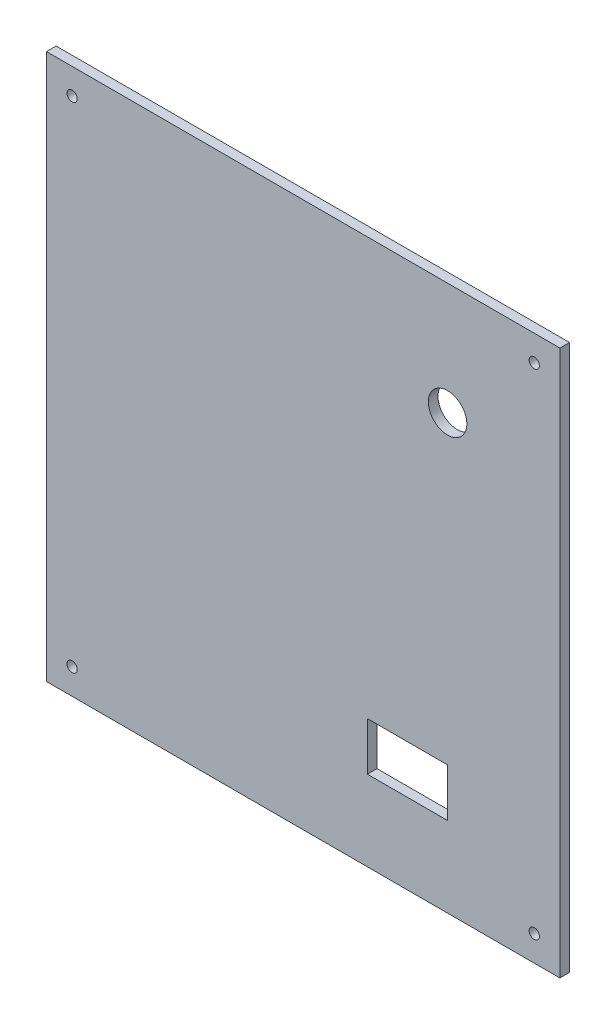
ISO-10303-21;
HEADER;
FILE_DESCRIPTION(('STEP AP214'),'2;1');
FILE_NAME('part.step','',(''),(''),'','','');
FILE_SCHEMA(('AUTOMOTIVE_DESIGN { 1 0 10303 214 1 1 1 1 }'));
ENDSEC;
DATA;
#1=APPLICATION_CONTEXT('core data for automotive mechanical design processes');
#2=APPLICATION_PROTOCOL_DEFINITION('international standard','automotive_design',2000,#1);
#3=PRODUCT_CONTEXT('',#1,'mechanical');
#4=PRODUCT('Part','Part','',(#3));
#5=PRODUCT_RELATED_PRODUCT_CATEGORY('part','',(#4));
#6=PRODUCT_DEFINITION_FORMATION('','',#4);
#7=PRODUCT_DEFINITION_CONTEXT('part definition',#1,'design');
#8=PRODUCT_DEFINITION('design','',#6,#7);
#9=PRODUCT_DEFINITION_SHAPE('','',#8);
#10=(LENGTH_UNIT() NAMED_UNIT(*) SI_UNIT(.MILLI.,.METRE.));
#11=(NAMED_UNIT(*) PLANE_ANGLE_UNIT() SI_UNIT($,.RADIAN.));
#12=(NAMED_UNIT(*) SI_UNIT($,.STERADIAN.) SOLID_ANGLE_UNIT());
#13=UNCERTAINTY_MEASURE_WITH_UNIT(LENGTH_MEASURE(1.E-05),#10,'distance_accuracy_value','');
#14=(GEOMETRIC_REPRESENTATION_CONTEXT(3) GLOBAL_UNCERTAINTY_ASSIGNED_CONTEXT((#13)) GLOBAL_UNIT_ASSIGNED_CONTEXT((#10,
#11,#12)) REPRESENTATION_CONTEXT('',''));
#15=CARTESIAN_POINT('',(0.,0.,0.));
#16=DIRECTION('',(0.,0.,1.));
#17=DIRECTION('',(1.,0.,0.));
#18=AXIS2_PLACEMENT_3D('',#15,#16,#17);
#19=CARTESIAN_POINT('',(-44.5833333333333,38.75,3.));
#20=DIRECTION('',(1.,0.,0.));
#21=DIRECTION('',(0.,1.,0.));
#22=AXIS2_PLACEMENT_3D('',#19,#20,#21);
#23=PLANE('',#22);
#24=DIRECTION('',(0.,-1.,0.));
#25=VECTOR('',#24,1.);
#26=CARTESIAN_POINT('',(-44.5833333333333,38.75,0.));
#27=LINE('',#26,#25);
#28=CARTESIAN_POINT('',(-44.5833333333333,38.75,0.));
#29=VERTEX_POINT('',#28);
#30=CARTESIAN_POINT('',(-44.5833333333333,-131.25,0.));
#31=VERTEX_POINT('',#30);
#32=EDGE_CURVE('E185',#29,#31,#27,.T.);
#33=ORIENTED_EDGE('',*,*,#32,.T.);
#34=DIRECTION('',(0.,0.,-1.));
#35=VECTOR('',#34,1.);
#36=CARTESIAN_POINT('',(-44.5833333333333,-131.25,3.));
#37=LINE('',#36,#35);
#38=CARTESIAN_POINT('',(-44.5833333333333,-131.25,3.));
#39=VERTEX_POINT('',#38);
#40=EDGE_CURVE('E208',#39,#31,#37,.T.);
#41=ORIENTED_EDGE('',*,*,#40,.F.);
#42=DIRECTION('',(0.,-1.,0.));
#43=VECTOR('',#42,1.);
#44=CARTESIAN_POINT('',(-44.5833333333333,38.75,3.));
#45=LINE('',#44,#43);
#46=CARTESIAN_POINT('',(-44.5833333333333,38.75,3.));
#47=VERTEX_POINT('',#46);
#48=EDGE_CURVE('E170',#47,#39,#45,.T.);
#49=ORIENTED_EDGE('',*,*,#48,.F.);
#50=DIRECTION('',(0.,0.,-1.));
#51=VECTOR('',#50,1.);
#52=CARTESIAN_POINT('',(-44.5833333333333,38.75,3.));
#53=LINE('',#52,#51);
#54=EDGE_CURVE('E184',#47,#29,#53,.T.);
#55=ORIENTED_EDGE('',*,*,#54,.T.);
#56=EDGE_LOOP('',(#33,#41,#49,#55));
#57=FACE_BOUND('',#56,.T.);
#58=ADVANCED_FACE('F47',(#57),#23,.F.);
#59=CARTESIAN_POINT('',(-44.5833333333333,-131.25,3.));
#60=DIRECTION('',(0.,1.,0.));
#61=DIRECTION('',(0.,0.,1.));
#62=AXIS2_PLACEMENT_3D('',#59,#60,#61);
#63=PLANE('',#62);
#64=DIRECTION('',(1.,0.,0.));
#65=VECTOR('',#64,1.);
#66=CARTESIAN_POINT('',(-44.5833333333333,-131.25,0.));
#67=LINE('',#66,#65);
#68=CARTESIAN_POINT('',(115.416666666667,-131.25,0.));
#69=VERTEX_POINT('',#68);
#70=EDGE_CURVE('E189',#31,#69,#67,.T.);
#71=ORIENTED_EDGE('',*,*,#70,.T.);
#72=DIRECTION('',(0.,0.,-1.));
#73=VECTOR('',#72,1.);
#74=CARTESIAN_POINT('',(115.416666666667,-131.25,3.));
#75=LINE('',#74,#73);
#76=CARTESIAN_POINT('',(115.416666666667,-131.25,3.));
#77=VERTEX_POINT('',#76);
#78=EDGE_CURVE('E204',#77,#69,#75,.T.);
#79=ORIENTED_EDGE('',*,*,#78,.F.);
#80=DIRECTION('',(1.,0.,0.));
#81=VECTOR('',#80,1.);
#82=CARTESIAN_POINT('',(-44.5833333333333,-131.25,3.));
#83=LINE('',#82,#81);
#84=EDGE_CURVE('E174',#39,#77,#83,.T.);
#85=ORIENTED_EDGE('',*,*,#84,.F.);
#86=ORIENTED_EDGE('',*,*,#40,.T.);
#87=EDGE_LOOP('',(#71,#79,#85,#86));
#88=FACE_BOUND('',#87,.T.);
#89=ADVANCED_FACE('F255',(#88),#63,.F.);
#90=CARTESIAN_POINT('',(115.416666666667,38.75,3.));
#91=DIRECTION('',(-1.,0.,0.));
#92=DIRECTION('',(0.,-1.,0.));
#93=AXIS2_PLACEMENT_3D('',#90,#91,#92);
#94=PLANE('',#93);
#95=DIRECTION('',(0.,1.,0.));
#96=VECTOR('',#95,1.);
#97=CARTESIAN_POINT('',(115.416666666667,38.75,0.));
#98=LINE('',#97,#96);
#99=CARTESIAN_POINT('',(115.416666666667,38.75,0.));
#100=VERTEX_POINT('',#99);
#101=EDGE_CURVE('E193',#69,#100,#98,.T.);
#102=ORIENTED_EDGE('',*,*,#101,.T.);
#103=DIRECTION('',(0.,0.,-1.));
#104=VECTOR('',#103,1.);
#105=CARTESIAN_POINT('',(115.416666666667,38.75,3.));
#106=LINE('',#105,#104);
#107=CARTESIAN_POINT('',(115.416666666667,38.75,3.));
#108=VERTEX_POINT('',#107);
#109=EDGE_CURVE('E201',#108,#100,#106,.T.);
#110=ORIENTED_EDGE('',*,*,#109,.F.);
#111=DIRECTION('',(0.,1.,0.));
#112=VECTOR('',#111,1.);
#113=CARTESIAN_POINT('',(115.416666666667,38.75,3.));
#114=LINE('',#113,#112);
#115=EDGE_CURVE('E178',#77,#108,#114,.T.);
#116=ORIENTED_EDGE('',*,*,#115,.F.);
#117=ORIENTED_EDGE('',*,*,#78,.T.);
#118=EDGE_LOOP('',(#102,#110,#116,#117));
#119=FACE_BOUND('',#118,.T.);
#120=ADVANCED_FACE('F260',(#119),#94,.F.);
#121=CARTESIAN_POINT('',(-44.5833333333333,38.75,3.));
#122=DIRECTION('',(0.,-1.,0.));
#123=DIRECTION('',(0.,0.,-1.));
#124=AXIS2_PLACEMENT_3D('',#121,#122,#123);
#125=PLANE('',#124);
#126=DIRECTION('',(-1.,0.,0.));
#127=VECTOR('',#126,1.);
#128=CARTESIAN_POINT('',(-44.5833333333333,38.75,0.));
#129=LINE('',#128,#127);
#130=EDGE_CURVE('E175',#100,#29,#129,.T.);
#131=ORIENTED_EDGE('',*,*,#130,.T.);
#132=ORIENTED_EDGE('',*,*,#54,.F.);
#133=DIRECTION('',(-1.,0.,0.));
#134=VECTOR('',#133,1.);
#135=CARTESIAN_POINT('',(-44.5833333333333,38.75,3.));
#136=LINE('',#135,#134);
#137=EDGE_CURVE('E181',#108,#47,#136,.T.);
#138=ORIENTED_EDGE('',*,*,#137,.F.);
#139=ORIENTED_EDGE('',*,*,#109,.T.);
#140=EDGE_LOOP('',(#131,#132,#138,#139));
#141=FACE_BOUND('',#140,.T.);
#142=ADVANCED_FACE('F275',(#141),#125,.F.);
#143=CARTESIAN_POINT('',(0.,0.,3.));
#144=DIRECTION('',(0.,0.,1.));
#145=DIRECTION('',(1.,0.,0.));
#146=AXIS2_PLACEMENT_3D('',#143,#144,#145);
#147=PLANE('',#146);
#148=DIRECTION('',(0.,-1.,0.));
#149=VECTOR('',#148,1.);
#150=CARTESIAN_POINT('',(55.4166666666667,-91.25,3.));
#151=LINE('',#150,#149);
#152=CARTESIAN_POINT('',(55.4166666666667,-91.25,3.));
#153=VERTEX_POINT('',#152);
#154=CARTESIAN_POINT('',(55.4166666666667,-106.25,3.));
#155=VERTEX_POINT('',#154);
#156=EDGE_CURVE('E62',#153,#155,#151,.T.);
#157=ORIENTED_EDGE('',*,*,#156,.F.);
#158=DIRECTION('',(-1.,0.,0.));
#159=VECTOR('',#158,1.);
#160=CARTESIAN_POINT('',(55.4166666666667,-91.25,3.));
#161=LINE('',#160,#159);
#162=CARTESIAN_POINT('',(80.4166666666667,-91.25,3.));
#163=VERTEX_POINT('',#162);
#164=EDGE_CURVE('E133',#163,#153,#161,.T.);
#165=ORIENTED_EDGE('',*,*,#164,.F.);
#166=DIRECTION('',(0.,1.,0.));
#167=VECTOR('',#166,1.);
#168=CARTESIAN_POINT('',(80.4166666666667,-91.25,3.));
#169=LINE('',#168,#167);
#170=CARTESIAN_POINT('',(80.4166666666667,-106.25,3.));
#171=VERTEX_POINT('',#170);
#172=EDGE_CURVE('E115',#171,#163,#169,.T.);
#173=ORIENTED_EDGE('',*,*,#172,.F.);
#174=DIRECTION('',(1.,0.,0.));
#175=VECTOR('',#174,1.);
#176=CARTESIAN_POINT('',(55.4166666666667,-106.25,3.));
#177=LINE('',#176,#175);
#178=EDGE_CURVE('E125',#155,#171,#177,.T.);
#179=ORIENTED_EDGE('',*,*,#178,.F.);
#180=EDGE_LOOP('',(#157,#165,#173,#179));
#181=FACE_BOUND('',#180,.T.);
#182=CARTESIAN_POINT('',(80.4166666666667,3.75,3.));
#183=DIRECTION('',(0.,0.,1.));
#184=DIRECTION('',(1.,0.,0.));
#185=AXIS2_PLACEMENT_3D('',#182,#183,#184);
#186=CIRCLE('',#185,6.);
#187=CARTESIAN_POINT('',(86.4166666666667,3.75,3.));
#188=VERTEX_POINT('',#187);
#189=EDGE_CURVE('E145',#188,#188,#186,.T.);
#190=ORIENTED_EDGE('',*,*,#189,.F.);
#191=EDGE_LOOP('',(#190));
#192=FACE_BOUND('',#191,.T.);
#193=CARTESIAN_POINT('',(-36.5833333333333,-123.25,3.));
#194=DIRECTION('',(0.,0.,1.));
#195=DIRECTION('',(-1.,0.,0.));
#196=AXIS2_PLACEMENT_3D('',#193,#194,#195);
#197=CIRCLE('',#196,1.6);
#198=CARTESIAN_POINT('',(-38.1833333333333,-123.25,3.));
#199=VERTEX_POINT('',#198);
#200=EDGE_CURVE('E162',#199,#199,#197,.T.);
#201=ORIENTED_EDGE('',*,*,#200,.F.);
#202=EDGE_LOOP('',(#201));
#203=FACE_BOUND('',#202,.T.);
#204=CARTESIAN_POINT('',(107.416666666667,-123.25,3.));
#205=DIRECTION('',(0.,0.,1.));
#206=DIRECTION('',(1.,0.,0.));
#207=AXIS2_PLACEMENT_3D('',#204,#205,#206);
#208=CIRCLE('',#207,1.60000000000002);
#209=CARTESIAN_POINT('',(109.016666666667,-123.25,3.));
#210=VERTEX_POINT('',#209);
#211=EDGE_CURVE('E158',#210,#210,#208,.T.);
#212=ORIENTED_EDGE('',*,*,#211,.F.);
#213=EDGE_LOOP('',(#212));
#214=FACE_BOUND('',#213,.T.);
#215=CARTESIAN_POINT('',(107.416666666667,30.75,3.));
#216=DIRECTION('',(0.,0.,1.));
#217=DIRECTION('',(-1.,0.,0.));
#218=AXIS2_PLACEMENT_3D('',#215,#216,#217);
#219=CIRCLE('',#218,1.60000000000002);
#220=CARTESIAN_POINT('',(105.816666666667,30.75,3.));
#221=VERTEX_POINT('',#220);
#222=EDGE_CURVE('E153',#221,#221,#219,.T.);
#223=ORIENTED_EDGE('',*,*,#222,.F.);
#224=EDGE_LOOP('',(#223));
#225=FACE_BOUND('',#224,.T.);
#226=CARTESIAN_POINT('',(-36.5833333333333,30.75,3.));
#227=DIRECTION('',(0.,0.,1.));
#228=DIRECTION('',(1.,0.,0.));
#229=AXIS2_PLACEMENT_3D('',#226,#227,#228);
#230=CIRCLE('',#229,1.6);
#231=CARTESIAN_POINT('',(-34.9833333333333,30.75,3.));
#232=VERTEX_POINT('',#231);
#233=EDGE_CURVE('E157',#232,#232,#230,.T.);
#234=ORIENTED_EDGE('',*,*,#233,.F.);
#235=EDGE_LOOP('',(#234));
#236=FACE_BOUND('',#235,.T.);
#237=ORIENTED_EDGE('',*,*,#48,.T.);
#238=ORIENTED_EDGE('',*,*,#84,.T.);
#239=ORIENTED_EDGE('',*,*,#115,.T.);
#240=ORIENTED_EDGE('',*,*,#137,.T.);
#241=EDGE_LOOP('',(#237,#238,#239,#240));
#242=FACE_BOUND('',#241,.T.);
#243=ADVANCED_FACE('F130',(#181,#192,#203,#214,#225,#236,#242),#147,.T.);
#244=CARTESIAN_POINT('',(0.,0.,0.));
#245=DIRECTION('',(0.,0.,1.));
#246=DIRECTION('',(1.,0.,0.));
#247=AXIS2_PLACEMENT_3D('',#244,#245,#246);
#248=PLANE('',#247);
#249=DIRECTION('',(-1.,0.,0.));
#250=VECTOR('',#249,1.);
#251=CARTESIAN_POINT('',(0.,-91.25,0.));
#252=LINE('',#251,#250);
#253=CARTESIAN_POINT('',(80.4166666666667,-91.25,0.));
#254=VERTEX_POINT('',#253);
#255=CARTESIAN_POINT('',(55.4166666666667,-91.25,0.));
#256=VERTEX_POINT('',#255);
#257=EDGE_CURVE('E55',#254,#256,#252,.T.);
#258=ORIENTED_EDGE('',*,*,#257,.T.);
#259=DIRECTION('',(0.,-1.,0.));
#260=VECTOR('',#259,1.);
#261=CARTESIAN_POINT('',(55.4166666666667,0.,0.));
#262=LINE('',#261,#260);
#263=CARTESIAN_POINT('',(55.4166666666667,-106.25,0.));
#264=VERTEX_POINT('',#263);
#265=EDGE_CURVE('E11',#256,#264,#262,.T.);
#266=ORIENTED_EDGE('',*,*,#265,.T.);
#267=DIRECTION('',(1.,0.,0.));
#268=VECTOR('',#267,1.);
#269=CARTESIAN_POINT('',(0.,-106.25,0.));
#270=LINE('',#269,#268);
#271=CARTESIAN_POINT('',(80.4166666666667,-106.25,0.));
#272=VERTEX_POINT('',#271);
#273=EDGE_CURVE('E212',#264,#272,#270,.T.);
#274=ORIENTED_EDGE('',*,*,#273,.T.);
#275=DIRECTION('',(0.,1.,0.));
#276=VECTOR('',#275,1.);
#277=CARTESIAN_POINT('',(80.4166666666667,0.,0.));
#278=LINE('',#277,#276);
#279=EDGE_CURVE('E118',#272,#254,#278,.T.);
#280=ORIENTED_EDGE('',*,*,#279,.T.);
#281=EDGE_LOOP('',(#258,#266,#274,#280));
#282=FACE_BOUND('',#281,.T.);
#283=CARTESIAN_POINT('',(80.4166666666667,3.75,0.));
#284=DIRECTION('',(0.,0.,1.));
#285=DIRECTION('',(1.,0.,0.));
#286=AXIS2_PLACEMENT_3D('',#283,#284,#285);
#287=CIRCLE('',#286,6.);
#288=CARTESIAN_POINT('',(86.4166666666667,3.75,0.));
#289=VERTEX_POINT('',#288);
#290=EDGE_CURVE('E152',#289,#289,#287,.T.);
#291=ORIENTED_EDGE('',*,*,#290,.T.);
#292=EDGE_LOOP('',(#291));
#293=FACE_BOUND('',#292,.T.);
#294=CARTESIAN_POINT('',(-36.5833333333333,-123.25,0.));
#295=DIRECTION('',(0.,0.,1.));
#296=DIRECTION('',(1.,0.,0.));
#297=AXIS2_PLACEMENT_3D('',#294,#295,#296);
#298=CIRCLE('',#297,1.6);
#299=CARTESIAN_POINT('',(-34.9833333333333,-123.25,0.));
#300=VERTEX_POINT('',#299);
#301=EDGE_CURVE('E190',#300,#300,#298,.T.);
#302=ORIENTED_EDGE('',*,*,#301,.T.);
#303=EDGE_LOOP('',(#302));
#304=FACE_BOUND('',#303,.T.);
#305=CARTESIAN_POINT('',(107.416666666667,-123.25,0.));
#306=DIRECTION('',(0.,0.,1.));
#307=DIRECTION('',(1.,0.,0.));
#308=AXIS2_PLACEMENT_3D('',#305,#306,#307);
#309=CIRCLE('',#308,1.60000000000002);
#310=CARTESIAN_POINT('',(109.016666666667,-123.25,0.));
#311=VERTEX_POINT('',#310);
#312=EDGE_CURVE('E220',#311,#311,#309,.T.);
#313=ORIENTED_EDGE('',*,*,#312,.T.);
#314=EDGE_LOOP('',(#313));
#315=FACE_BOUND('',#314,.T.);
#316=CARTESIAN_POINT('',(107.416666666667,30.75,0.));
#317=DIRECTION('',(0.,0.,1.));
#318=DIRECTION('',(1.,0.,0.));
#319=AXIS2_PLACEMENT_3D('',#316,#317,#318);
#320=CIRCLE('',#319,1.60000000000002);
#321=CARTESIAN_POINT('',(109.016666666667,30.75,0.));
#322=VERTEX_POINT('',#321);
#323=EDGE_CURVE('E216',#322,#322,#320,.T.);
#324=ORIENTED_EDGE('',*,*,#323,.T.);
#325=EDGE_LOOP('',(#324));
#326=FACE_BOUND('',#325,.T.);
#327=CARTESIAN_POINT('',(-36.5833333333333,30.75,0.));
#328=DIRECTION('',(0.,0.,1.));
#329=DIRECTION('',(1.,0.,0.));
#330=AXIS2_PLACEMENT_3D('',#327,#328,#329);
#331=CIRCLE('',#330,1.6);
#332=CARTESIAN_POINT('',(-34.9833333333333,30.75,0.));
#333=VERTEX_POINT('',#332);
#334=EDGE_CURVE('E169',#333,#333,#331,.T.);
#335=ORIENTED_EDGE('',*,*,#334,.T.);
#336=EDGE_LOOP('',(#335));
#337=FACE_BOUND('',#336,.T.);
#338=ORIENTED_EDGE('',*,*,#32,.F.);
#339=ORIENTED_EDGE('',*,*,#130,.F.);
#340=ORIENTED_EDGE('',*,*,#101,.F.);
#341=ORIENTED_EDGE('',*,*,#70,.F.);
#342=EDGE_LOOP('',(#338,#339,#340,#341));
#343=FACE_BOUND('',#342,.T.);
#344=ADVANCED_FACE('F236',(#282,#293,#304,#315,#326,#337,#343),#248,.F.);
#345=CARTESIAN_POINT('',(-36.5833333333333,30.75,-10.));
#346=DIRECTION('',(0.,0.,1.));
#347=DIRECTION('',(1.,0.,0.));
#348=AXIS2_PLACEMENT_3D('',#345,#346,#347);
#349=CYLINDRICAL_SURFACE('',#348,1.6);
#350=ORIENTED_EDGE('',*,*,#233,.T.);
#351=EDGE_LOOP('',(#350));
#352=FACE_BOUND('',#351,.T.);
#353=ORIENTED_EDGE('',*,*,#334,.F.);
#354=EDGE_LOOP('',(#353));
#355=FACE_BOUND('',#354,.T.);
#356=ADVANCED_FACE('F286',(#352,#355),#349,.F.);
#357=CARTESIAN_POINT('',(107.416666666667,30.75,-10.));
#358=DIRECTION('',(0.,0.,1.));
#359=DIRECTION('',(1.,0.,0.));
#360=AXIS2_PLACEMENT_3D('',#357,#358,#359);
#361=CYLINDRICAL_SURFACE('',#360,1.60000000000002);
#362=ORIENTED_EDGE('',*,*,#222,.T.);
#363=EDGE_LOOP('',(#362));
#364=FACE_BOUND('',#363,.T.);
#365=ORIENTED_EDGE('',*,*,#323,.F.);
#366=EDGE_LOOP('',(#365));
#367=FACE_BOUND('',#366,.T.);
#368=ADVANCED_FACE('F291',(#364,#367),#361,.F.);
#369=CARTESIAN_POINT('',(107.416666666667,-123.25,-10.));
#370=DIRECTION('',(0.,0.,1.));
#371=DIRECTION('',(1.,0.,0.));
#372=AXIS2_PLACEMENT_3D('',#369,#370,#371);
#373=CYLINDRICAL_SURFACE('',#372,1.60000000000002);
#374=ORIENTED_EDGE('',*,*,#211,.T.);
#375=EDGE_LOOP('',(#374));
#376=FACE_BOUND('',#375,.T.);
#377=ORIENTED_EDGE('',*,*,#312,.F.);
#378=EDGE_LOOP('',(#377));
#379=FACE_BOUND('',#378,.T.);
#380=ADVANCED_FACE('F295',(#376,#379),#373,.F.);
#381=CARTESIAN_POINT('',(-36.5833333333333,-123.25,-10.));
#382=DIRECTION('',(0.,0.,1.));
#383=DIRECTION('',(1.,0.,0.));
#384=AXIS2_PLACEMENT_3D('',#381,#382,#383);
#385=CYLINDRICAL_SURFACE('',#384,1.6);
#386=ORIENTED_EDGE('',*,*,#200,.T.);
#387=EDGE_LOOP('',(#386));
#388=FACE_BOUND('',#387,.T.);
#389=ORIENTED_EDGE('',*,*,#301,.F.);
#390=EDGE_LOOP('',(#389));
#391=FACE_BOUND('',#390,.T.);
#392=ADVANCED_FACE('F250',(#388,#391),#385,.F.);
#393=CARTESIAN_POINT('',(80.4166666666667,3.75,-10.));
#394=DIRECTION('',(0.,0.,1.));
#395=DIRECTION('',(1.,0.,0.));
#396=AXIS2_PLACEMENT_3D('',#393,#394,#395);
#397=CYLINDRICAL_SURFACE('',#396,6.);
#398=ORIENTED_EDGE('',*,*,#189,.T.);
#399=EDGE_LOOP('',(#398));
#400=FACE_BOUND('',#399,.T.);
#401=ORIENTED_EDGE('',*,*,#290,.F.);
#402=EDGE_LOOP('',(#401));
#403=FACE_BOUND('',#402,.T.);
#404=ADVANCED_FACE('F243',(#400,#403),#397,.F.);
#405=CARTESIAN_POINT('',(55.4166666666667,-91.25,-10.));
#406=DIRECTION('',(-1.,0.,0.));
#407=DIRECTION('',(0.,0.,1.));
#408=AXIS2_PLACEMENT_3D('',#405,#406,#407);
#409=PLANE('',#408);
#410=DIRECTION('',(0.,0.,1.));
#411=VECTOR('',#410,1.);
#412=CARTESIAN_POINT('',(55.4166666666667,-91.25,-10.));
#413=LINE('',#412,#411);
#414=EDGE_CURVE('E142',#256,#153,#413,.T.);
#415=ORIENTED_EDGE('',*,*,#414,.T.);
#416=ORIENTED_EDGE('',*,*,#156,.T.);
#417=DIRECTION('',(0.,0.,1.));
#418=VECTOR('',#417,1.);
#419=CARTESIAN_POINT('',(55.4166666666667,-106.25,-10.));
#420=LINE('',#419,#418);
#421=EDGE_CURVE('E122',#264,#155,#420,.T.);
#422=ORIENTED_EDGE('',*,*,#421,.F.);
#423=ORIENTED_EDGE('',*,*,#265,.F.);
#424=EDGE_LOOP('',(#415,#416,#422,#423));
#425=FACE_BOUND('',#424,.T.);
#426=ADVANCED_FACE('F241',(#425),#409,.F.);
#427=CARTESIAN_POINT('',(55.4166666666667,-91.25,-10.));
#428=DIRECTION('',(0.,1.,0.));
#429=DIRECTION('',(0.,0.,1.));
#430=AXIS2_PLACEMENT_3D('',#427,#428,#429);
#431=PLANE('',#430);
#432=DIRECTION('',(0.,0.,1.));
#433=VECTOR('',#432,1.);
#434=CARTESIAN_POINT('',(80.4166666666667,-91.25,-10.));
#435=LINE('',#434,#433);
#436=EDGE_CURVE('E121',#254,#163,#435,.T.);
#437=ORIENTED_EDGE('',*,*,#436,.T.);
#438=ORIENTED_EDGE('',*,*,#164,.T.);
#439=ORIENTED_EDGE('',*,*,#414,.F.);
#440=ORIENTED_EDGE('',*,*,#257,.F.);
#441=EDGE_LOOP('',(#437,#438,#439,#440));
#442=FACE_BOUND('',#441,.T.);
#443=ADVANCED_FACE('F240',(#442),#431,.F.);
#444=CARTESIAN_POINT('',(80.4166666666667,-91.25,-10.));
#445=DIRECTION('',(1.,0.,0.));
#446=DIRECTION('',(0.,0.,-1.));
#447=AXIS2_PLACEMENT_3D('',#444,#445,#446);
#448=PLANE('',#447);
#449=DIRECTION('',(0.,0.,1.));
#450=VECTOR('',#449,1.);
#451=CARTESIAN_POINT('',(80.4166666666667,-106.25,-10.));
#452=LINE('',#451,#450);
#453=EDGE_CURVE('E70',#272,#171,#452,.T.);
#454=ORIENTED_EDGE('',*,*,#453,.T.);
#455=ORIENTED_EDGE('',*,*,#172,.T.);
#456=ORIENTED_EDGE('',*,*,#436,.F.);
#457=ORIENTED_EDGE('',*,*,#279,.F.);
#458=EDGE_LOOP('',(#454,#455,#456,#457));
#459=FACE_BOUND('',#458,.T.);
#460=ADVANCED_FACE('F112',(#459),#448,.F.);
#461=CARTESIAN_POINT('',(55.4166666666667,-106.25,-10.));
#462=DIRECTION('',(0.,-1.,0.));
#463=DIRECTION('',(0.,0.,-1.));
#464=AXIS2_PLACEMENT_3D('',#461,#462,#463);
#465=PLANE('',#464);
#466=ORIENTED_EDGE('',*,*,#421,.T.);
#467=ORIENTED_EDGE('',*,*,#178,.T.);
#468=ORIENTED_EDGE('',*,*,#453,.F.);
#469=ORIENTED_EDGE('',*,*,#273,.F.);
#470=EDGE_LOOP('',(#466,#467,#468,#469));
#471=FACE_BOUND('',#470,.T.);
#472=ADVANCED_FACE('F126',(#471),#465,.F.);
#473=CLOSED_SHELL('',(#58,#89,#120,#142,#243,#344,#356,#368,#380,#392,#404,#426,#443,#460,#472));
#474=MANIFOLD_SOLID_BREP('B2',#473);
#475=ADVANCED_BREP_SHAPE_REPRESENTATION('',(#18,#474),#14);
#476=SHAPE_DEFINITION_REPRESENTATION(#9,#475);
ENDSEC;
END-ISO-10303-21;
